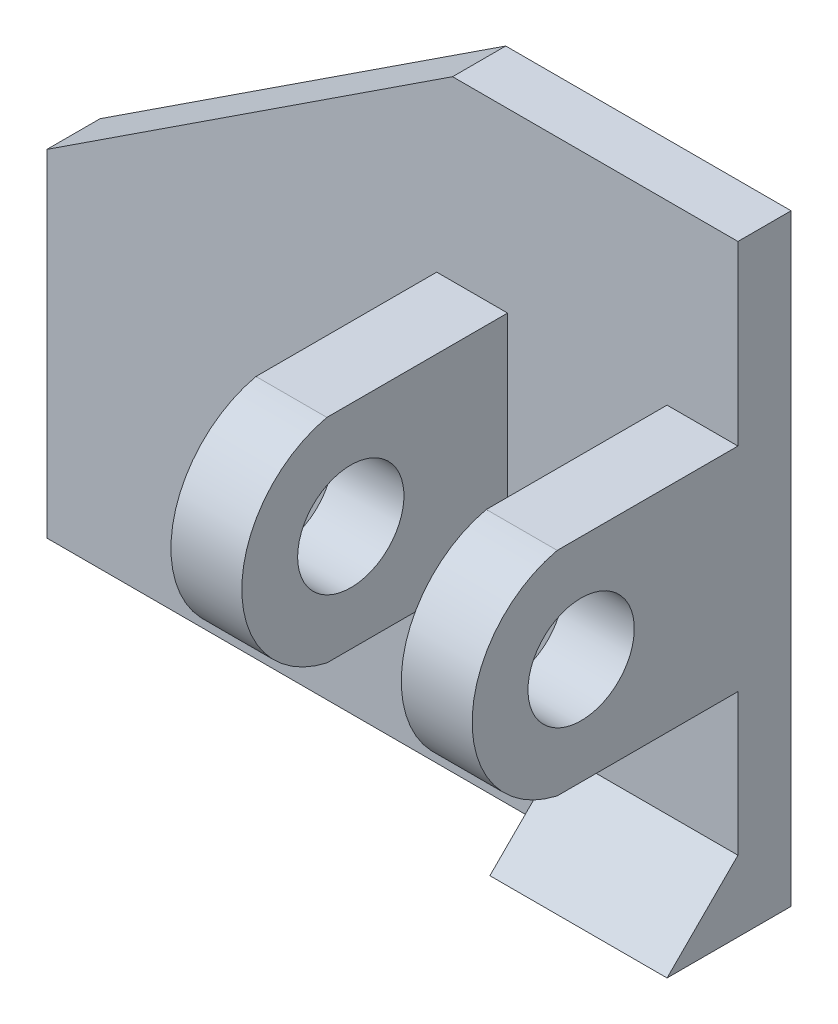
ISO-10303-21;
HEADER;
FILE_DESCRIPTION(('STEP AP214'),'2;1');
FILE_NAME('part.step','',(''),(''),'','','');
FILE_SCHEMA(('AUTOMOTIVE_DESIGN { 1 0 10303 214 1 1 1 1 }'));
ENDSEC;
DATA;
#1=APPLICATION_CONTEXT('core data for automotive mechanical design processes');
#2=APPLICATION_PROTOCOL_DEFINITION('international standard','automotive_design',2000,#1);
#3=PRODUCT_CONTEXT('',#1,'mechanical');
#4=PRODUCT('Part','Part','',(#3));
#5=PRODUCT_RELATED_PRODUCT_CATEGORY('part','',(#4));
#6=PRODUCT_DEFINITION_FORMATION('','',#4);
#7=PRODUCT_DEFINITION_CONTEXT('part definition',#1,'design');
#8=PRODUCT_DEFINITION('design','',#6,#7);
#9=PRODUCT_DEFINITION_SHAPE('','',#8);
#10=(LENGTH_UNIT() NAMED_UNIT(*) SI_UNIT(.MILLI.,.METRE.));
#11=(NAMED_UNIT(*) PLANE_ANGLE_UNIT() SI_UNIT($,.RADIAN.));
#12=(NAMED_UNIT(*) SI_UNIT($,.STERADIAN.) SOLID_ANGLE_UNIT());
#13=UNCERTAINTY_MEASURE_WITH_UNIT(LENGTH_MEASURE(1.E-05),#10,'distance_accuracy_value','');
#14=(GEOMETRIC_REPRESENTATION_CONTEXT(3) GLOBAL_UNCERTAINTY_ASSIGNED_CONTEXT((#13)) GLOBAL_UNIT_ASSIGNED_CONTEXT((#10,
#11,#12)) REPRESENTATION_CONTEXT('',''));
#15=CARTESIAN_POINT('',(0.,0.,0.));
#16=DIRECTION('',(0.,0.,1.));
#17=DIRECTION('',(1.,0.,0.));
#18=AXIS2_PLACEMENT_3D('',#15,#16,#17);
#19=CARTESIAN_POINT('',(14.5,0.,3.));
#20=DIRECTION('',(1.,0.,0.));
#21=DIRECTION('',(0.,1.,0.));
#22=AXIS2_PLACEMENT_3D('',#19,#20,#21);
#23=PLANE('',#22);
#24=DIRECTION('',(0.,-1.,0.));
#25=VECTOR('',#24,1.);
#26=CARTESIAN_POINT('',(14.5,0.,3.));
#27=LINE('',#26,#25);
#28=CARTESIAN_POINT('',(14.5,-6.99999999999999,3.));
#29=VERTEX_POINT('',#28);
#30=CARTESIAN_POINT('',(14.5,-15.,3.));
#31=VERTEX_POINT('',#30);
#32=EDGE_CURVE('E303',#29,#31,#27,.T.);
#33=ORIENTED_EDGE('',*,*,#32,.T.);
#34=DIRECTION('',(0.,-0.707106781186551,0.707106781186544));
#35=VECTOR('',#34,1.);
#36=CARTESIAN_POINT('',(14.5,-7.49999999999994,-4.50000000000002));
#37=LINE('',#36,#35);
#38=CARTESIAN_POINT('',(14.5,-19.,6.99999999999993));
#39=VERTEX_POINT('',#38);
#40=EDGE_CURVE('E12',#31,#39,#37,.T.);
#41=ORIENTED_EDGE('',*,*,#40,.T.);
#42=DIRECTION('',(0.,0.,-1.));
#43=VECTOR('',#42,1.);
#44=CARTESIAN_POINT('',(14.5,-19.,3.));
#45=LINE('',#44,#43);
#46=CARTESIAN_POINT('',(14.5,-19.,0.));
#47=VERTEX_POINT('',#46);
#48=EDGE_CURVE('E348',#39,#47,#45,.T.);
#49=ORIENTED_EDGE('',*,*,#48,.T.);
#50=DIRECTION('',(0.,-1.,0.));
#51=VECTOR('',#50,1.);
#52=CARTESIAN_POINT('',(14.5,0.,0.));
#53=LINE('',#52,#51);
#54=CARTESIAN_POINT('',(14.5,15.,0.));
#55=VERTEX_POINT('',#54);
#56=EDGE_CURVE('E342',#55,#47,#53,.T.);
#57=ORIENTED_EDGE('',*,*,#56,.F.);
#58=DIRECTION('',(0.,0.,-1.));
#59=VECTOR('',#58,1.);
#60=CARTESIAN_POINT('',(14.5,15.,3.));
#61=LINE('',#60,#59);
#62=CARTESIAN_POINT('',(14.5,15.,3.));
#63=VERTEX_POINT('',#62);
#64=EDGE_CURVE('E330',#63,#55,#61,.T.);
#65=ORIENTED_EDGE('',*,*,#64,.F.);
#66=CARTESIAN_POINT('',(14.5,5.00000000000001,3.));
#67=VERTEX_POINT('',#66);
#68=EDGE_CURVE('E306',#63,#67,#27,.T.);
#69=ORIENTED_EDGE('',*,*,#68,.T.);
#70=DIRECTION('',(0.,0.,-1.));
#71=VECTOR('',#70,1.);
#72=CARTESIAN_POINT('',(14.5,5.00000000000001,18.));
#73=LINE('',#72,#71);
#74=CARTESIAN_POINT('',(14.5,5.00000000000001,13.2));
#75=VERTEX_POINT('',#74);
#76=EDGE_CURVE('E284',#75,#67,#73,.T.);
#77=ORIENTED_EDGE('',*,*,#76,.F.);
#78=CARTESIAN_POINT('',(14.5,-0.999999999999992,11.85));
#79=DIRECTION('',(1.,0.,0.));
#80=DIRECTION('',(0.,1.,0.));
#81=AXIS2_PLACEMENT_3D('',#78,#79,#80);
#82=CIRCLE('',#81,6.15);
#83=CARTESIAN_POINT('',(14.5,-6.99999999999999,13.2));
#84=VERTEX_POINT('',#83);
#85=EDGE_CURVE('E275',#75,#84,#82,.T.);
#86=ORIENTED_EDGE('',*,*,#85,.T.);
#87=DIRECTION('',(0.,0.,-1.));
#88=VECTOR('',#87,1.);
#89=CARTESIAN_POINT('',(14.5,-6.99999999999999,18.));
#90=LINE('',#89,#88);
#91=EDGE_CURVE('E286',#84,#29,#90,.T.);
#92=ORIENTED_EDGE('',*,*,#91,.T.);
#93=EDGE_LOOP('',(#33,#41,#49,#57,#65,#69,#77,#86,#92));
#94=FACE_BOUND('',#93,.T.);
#95=CARTESIAN_POINT('',(14.5,-0.999999999999992,11.85));
#96=DIRECTION('',(1.,0.,0.));
#97=DIRECTION('',(0.,1.,0.));
#98=AXIS2_PLACEMENT_3D('',#95,#96,#97);
#99=CIRCLE('',#98,3.);
#100=CARTESIAN_POINT('',(14.5,2.00000000000001,11.85));
#101=VERTEX_POINT('',#100);
#102=EDGE_CURVE('E258',#101,#101,#99,.T.);
#103=ORIENTED_EDGE('',*,*,#102,.F.);
#104=EDGE_LOOP('',(#103));
#105=FACE_BOUND('',#104,.T.);
#106=ADVANCED_FACE('F119',(#94,#105),#23,.T.);
#107=CARTESIAN_POINT('',(10.5,0.,18.));
#108=DIRECTION('',(1.,0.,0.));
#109=DIRECTION('',(0.,1.,0.));
#110=AXIS2_PLACEMENT_3D('',#107,#108,#109);
#111=PLANE('',#110);
#112=CARTESIAN_POINT('',(10.5,-0.999999999999992,11.85));
#113=DIRECTION('',(1.,0.,0.));
#114=DIRECTION('',(0.,1.,0.));
#115=AXIS2_PLACEMENT_3D('',#112,#113,#114);
#116=CIRCLE('',#115,3.);
#117=CARTESIAN_POINT('',(10.5,2.00000000000001,11.85));
#118=VERTEX_POINT('',#117);
#119=EDGE_CURVE('E255',#118,#118,#116,.T.);
#120=ORIENTED_EDGE('',*,*,#119,.T.);
#121=EDGE_LOOP('',(#120));
#122=FACE_BOUND('',#121,.T.);
#123=DIRECTION('',(0.,0.,-1.));
#124=VECTOR('',#123,1.);
#125=CARTESIAN_POINT('',(10.5,-7.,18.));
#126=LINE('',#125,#124);
#127=CARTESIAN_POINT('',(10.5,-6.99999999999999,13.2));
#128=VERTEX_POINT('',#127);
#129=CARTESIAN_POINT('',(10.5,-7.,3.));
#130=VERTEX_POINT('',#129);
#131=EDGE_CURVE('E288',#128,#130,#126,.T.);
#132=ORIENTED_EDGE('',*,*,#131,.F.);
#133=CARTESIAN_POINT('',(10.5,-0.999999999999992,11.85));
#134=DIRECTION('',(1.,0.,0.));
#135=DIRECTION('',(0.,1.,0.));
#136=AXIS2_PLACEMENT_3D('',#133,#134,#135);
#137=CIRCLE('',#136,6.15);
#138=CARTESIAN_POINT('',(10.5,5.00000000000001,13.2));
#139=VERTEX_POINT('',#138);
#140=EDGE_CURVE('E273',#139,#128,#137,.T.);
#141=ORIENTED_EDGE('',*,*,#140,.F.);
#142=DIRECTION('',(0.,0.,-1.));
#143=VECTOR('',#142,1.);
#144=CARTESIAN_POINT('',(10.5,5.00000000000001,18.));
#145=LINE('',#144,#143);
#146=CARTESIAN_POINT('',(10.5,5.00000000000001,3.));
#147=VERTEX_POINT('',#146);
#148=EDGE_CURVE('E290',#139,#147,#145,.T.);
#149=ORIENTED_EDGE('',*,*,#148,.T.);
#150=DIRECTION('',(0.,-1.,0.));
#151=VECTOR('',#150,1.);
#152=CARTESIAN_POINT('',(10.5,0.,3.));
#153=LINE('',#152,#151);
#154=EDGE_CURVE('E309',#147,#130,#153,.T.);
#155=ORIENTED_EDGE('',*,*,#154,.T.);
#156=EDGE_LOOP('',(#132,#141,#149,#155));
#157=FACE_BOUND('',#156,.T.);
#158=ADVANCED_FACE('F374',(#122,#157),#111,.F.);
#159=CARTESIAN_POINT('',(1.5,0.,18.));
#160=DIRECTION('',(-1.,0.,0.));
#161=DIRECTION('',(0.,0.,1.));
#162=AXIS2_PLACEMENT_3D('',#159,#160,#161);
#163=PLANE('',#162);
#164=CARTESIAN_POINT('',(1.49999999999999,-0.999999999999991,11.85));
#165=DIRECTION('',(-1.,0.,0.));
#166=DIRECTION('',(0.,0.,1.));
#167=AXIS2_PLACEMENT_3D('',#164,#165,#166);
#168=CIRCLE('',#167,3.);
#169=CARTESIAN_POINT('',(1.49999999999999,-0.999999999999991,14.85));
#170=VERTEX_POINT('',#169);
#171=EDGE_CURVE('E252',#170,#170,#168,.T.);
#172=ORIENTED_EDGE('',*,*,#171,.T.);
#173=EDGE_LOOP('',(#172));
#174=FACE_BOUND('',#173,.T.);
#175=CARTESIAN_POINT('',(1.49999999999999,-0.999999999999991,11.85));
#176=DIRECTION('',(-1.,0.,0.));
#177=DIRECTION('',(0.,0.,1.));
#178=AXIS2_PLACEMENT_3D('',#175,#176,#177);
#179=CIRCLE('',#178,6.15);
#180=CARTESIAN_POINT('',(1.49999999999999,-6.99999999999999,13.2));
#181=VERTEX_POINT('',#180);
#182=CARTESIAN_POINT('',(1.49999999999999,5.00000000000001,13.2));
#183=VERTEX_POINT('',#182);
#184=EDGE_CURVE('E271',#181,#183,#179,.T.);
#185=ORIENTED_EDGE('',*,*,#184,.F.);
#186=DIRECTION('',(0.,0.,-1.));
#187=VECTOR('',#186,1.);
#188=CARTESIAN_POINT('',(1.5,-6.99999999999999,18.));
#189=LINE('',#188,#187);
#190=CARTESIAN_POINT('',(1.5,-6.99999999999999,3.));
#191=VERTEX_POINT('',#190);
#192=EDGE_CURVE('E282',#181,#191,#189,.T.);
#193=ORIENTED_EDGE('',*,*,#192,.T.);
#194=DIRECTION('',(0.,1.,0.));
#195=VECTOR('',#194,1.);
#196=CARTESIAN_POINT('',(1.5,0.,3.));
#197=LINE('',#196,#195);
#198=CARTESIAN_POINT('',(1.5,5.00000000000001,3.));
#199=VERTEX_POINT('',#198);
#200=EDGE_CURVE('E321',#191,#199,#197,.T.);
#201=ORIENTED_EDGE('',*,*,#200,.T.);
#202=DIRECTION('',(0.,0.,-1.));
#203=VECTOR('',#202,1.);
#204=CARTESIAN_POINT('',(1.5,5.00000000000001,18.));
#205=LINE('',#204,#203);
#206=EDGE_CURVE('E280',#183,#199,#205,.T.);
#207=ORIENTED_EDGE('',*,*,#206,.F.);
#208=EDGE_LOOP('',(#185,#193,#201,#207));
#209=FACE_BOUND('',#208,.T.);
#210=ADVANCED_FACE('F409',(#174,#209),#163,.F.);
#211=CARTESIAN_POINT('',(-2.5,0.,18.));
#212=DIRECTION('',(-1.,0.,0.));
#213=DIRECTION('',(0.,-1.,0.));
#214=AXIS2_PLACEMENT_3D('',#211,#212,#213);
#215=PLANE('',#214);
#216=CARTESIAN_POINT('',(-2.5,-0.999999999999991,11.85));
#217=DIRECTION('',(-1.,0.,0.));
#218=DIRECTION('',(0.,-1.,0.));
#219=AXIS2_PLACEMENT_3D('',#216,#217,#218);
#220=CIRCLE('',#219,3.);
#221=CARTESIAN_POINT('',(-2.5,-3.99999999999999,11.85));
#222=VERTEX_POINT('',#221);
#223=EDGE_CURVE('E251',#222,#222,#220,.T.);
#224=ORIENTED_EDGE('',*,*,#223,.F.);
#225=EDGE_LOOP('',(#224));
#226=FACE_BOUND('',#225,.T.);
#227=DIRECTION('',(0.,0.,-1.));
#228=VECTOR('',#227,1.);
#229=CARTESIAN_POINT('',(-2.5,-6.99999999999999,18.));
#230=LINE('',#229,#228);
#231=CARTESIAN_POINT('',(-2.5,-6.99999999999999,13.2));
#232=VERTEX_POINT('',#231);
#233=CARTESIAN_POINT('',(-2.5,-6.99999999999999,3.));
#234=VERTEX_POINT('',#233);
#235=EDGE_CURVE('E276',#232,#234,#230,.T.);
#236=ORIENTED_EDGE('',*,*,#235,.F.);
#237=CARTESIAN_POINT('',(-2.5,-0.999999999999991,11.85));
#238=DIRECTION('',(-1.,0.,0.));
#239=DIRECTION('',(0.,-1.,0.));
#240=AXIS2_PLACEMENT_3D('',#237,#238,#239);
#241=CIRCLE('',#240,6.15);
#242=CARTESIAN_POINT('',(-2.5,5.00000000000001,13.2));
#243=VERTEX_POINT('',#242);
#244=EDGE_CURVE('E268',#232,#243,#241,.T.);
#245=ORIENTED_EDGE('',*,*,#244,.T.);
#246=DIRECTION('',(0.,0.,-1.));
#247=VECTOR('',#246,1.);
#248=CARTESIAN_POINT('',(-2.5,5.00000000000001,18.));
#249=LINE('',#248,#247);
#250=CARTESIAN_POINT('',(-2.5,5.00000000000001,3.));
#251=VERTEX_POINT('',#250);
#252=EDGE_CURVE('E278',#243,#251,#249,.T.);
#253=ORIENTED_EDGE('',*,*,#252,.T.);
#254=DIRECTION('',(0.,1.,0.));
#255=VECTOR('',#254,1.);
#256=CARTESIAN_POINT('',(-2.5,0.,3.));
#257=LINE('',#256,#255);
#258=EDGE_CURVE('E327',#234,#251,#257,.T.);
#259=ORIENTED_EDGE('',*,*,#258,.F.);
#260=EDGE_LOOP('',(#236,#245,#253,#259));
#261=FACE_BOUND('',#260,.T.);
#262=ADVANCED_FACE('F426',(#226,#261),#215,.T.);
#263=CARTESIAN_POINT('',(0.,-7.,18.));
#264=DIRECTION('',(0.,-1.,0.));
#265=DIRECTION('',(1.,0.,0.));
#266=AXIS2_PLACEMENT_3D('',#263,#264,#265);
#267=PLANE('',#266);
#268=ORIENTED_EDGE('',*,*,#91,.F.);
#269=DIRECTION('',(1.,0.,0.));
#270=VECTOR('',#269,1.);
#271=CARTESIAN_POINT('',(-24.5,-6.99999999999999,13.2));
#272=LINE('',#271,#270);
#273=EDGE_CURVE('E240',#128,#84,#272,.T.);
#274=ORIENTED_EDGE('',*,*,#273,.F.);
#275=ORIENTED_EDGE('',*,*,#131,.T.);
#276=DIRECTION('',(-1.,0.,0.));
#277=VECTOR('',#276,1.);
#278=CARTESIAN_POINT('',(0.,-7.,3.));
#279=LINE('',#278,#277);
#280=EDGE_CURVE('E305',#29,#130,#279,.T.);
#281=ORIENTED_EDGE('',*,*,#280,.F.);
#282=EDGE_LOOP('',(#268,#274,#275,#281));
#283=FACE_BOUND('',#282,.T.);
#284=ADVANCED_FACE('F370',(#283),#267,.T.);
#285=CARTESIAN_POINT('',(0.,-6.99999999999999,18.));
#286=DIRECTION('',(0.,1.,0.));
#287=DIRECTION('',(0.,0.,1.));
#288=AXIS2_PLACEMENT_3D('',#285,#286,#287);
#289=PLANE('',#288);
#290=EDGE_CURVE('E248',#232,#181,#272,.T.);
#291=ORIENTED_EDGE('',*,*,#290,.F.);
#292=ORIENTED_EDGE('',*,*,#235,.T.);
#293=DIRECTION('',(1.,0.,0.));
#294=VECTOR('',#293,1.);
#295=CARTESIAN_POINT('',(0.,-6.99999999999999,3.));
#296=LINE('',#295,#294);
#297=EDGE_CURVE('E324',#234,#191,#296,.T.);
#298=ORIENTED_EDGE('',*,*,#297,.T.);
#299=ORIENTED_EDGE('',*,*,#192,.F.);
#300=EDGE_LOOP('',(#291,#292,#298,#299));
#301=FACE_BOUND('',#300,.T.);
#302=ADVANCED_FACE('F422',(#301),#289,.F.);
#303=CARTESIAN_POINT('',(0.,5.,18.));
#304=DIRECTION('',(0.,-1.,0.));
#305=DIRECTION('',(1.,0.,0.));
#306=AXIS2_PLACEMENT_3D('',#303,#304,#305);
#307=PLANE('',#306);
#308=DIRECTION('',(1.,0.,0.));
#309=VECTOR('',#308,1.);
#310=CARTESIAN_POINT('',(-24.5,5.00000000000001,13.2));
#311=LINE('',#310,#309);
#312=EDGE_CURVE('E261',#139,#75,#311,.T.);
#313=ORIENTED_EDGE('',*,*,#312,.T.);
#314=ORIENTED_EDGE('',*,*,#76,.T.);
#315=DIRECTION('',(-1.,0.,0.));
#316=VECTOR('',#315,1.);
#317=CARTESIAN_POINT('',(0.,5.,3.));
#318=LINE('',#317,#316);
#319=EDGE_CURVE('E312',#67,#147,#318,.T.);
#320=ORIENTED_EDGE('',*,*,#319,.T.);
#321=ORIENTED_EDGE('',*,*,#148,.F.);
#322=EDGE_LOOP('',(#313,#314,#320,#321));
#323=FACE_BOUND('',#322,.T.);
#324=ADVANCED_FACE('F377',(#323),#307,.F.);
#325=CARTESIAN_POINT('',(0.,5.00000000000001,18.));
#326=DIRECTION('',(0.,-1.,0.));
#327=DIRECTION('',(1.,0.,0.));
#328=AXIS2_PLACEMENT_3D('',#325,#326,#327);
#329=PLANE('',#328);
#330=EDGE_CURVE('E265',#243,#183,#311,.T.);
#331=ORIENTED_EDGE('',*,*,#330,.T.);
#332=ORIENTED_EDGE('',*,*,#206,.T.);
#333=DIRECTION('',(-1.,0.,0.));
#334=VECTOR('',#333,1.);
#335=CARTESIAN_POINT('',(0.,5.00000000000001,3.));
#336=LINE('',#335,#334);
#337=EDGE_CURVE('E318',#199,#251,#336,.T.);
#338=ORIENTED_EDGE('',*,*,#337,.T.);
#339=ORIENTED_EDGE('',*,*,#252,.F.);
#340=EDGE_LOOP('',(#331,#332,#338,#339));
#341=FACE_BOUND('',#340,.T.);
#342=ADVANCED_FACE('F421',(#341),#329,.F.);
#343=CARTESIAN_POINT('',(0.,15.,3.));
#344=DIRECTION('',(0.,1.,0.));
#345=DIRECTION('',(0.,0.,1.));
#346=AXIS2_PLACEMENT_3D('',#343,#344,#345);
#347=PLANE('',#346);
#348=DIRECTION('',(1.,0.,0.));
#349=VECTOR('',#348,1.);
#350=CARTESIAN_POINT('',(0.,15.,0.));
#351=LINE('',#350,#349);
#352=CARTESIAN_POINT('',(-1.60526315789473,15.,0.));
#353=VERTEX_POINT('',#352);
#354=EDGE_CURVE('E292',#353,#55,#351,.T.);
#355=ORIENTED_EDGE('',*,*,#354,.F.);
#356=DIRECTION('',(0.,0.,-1.));
#357=VECTOR('',#356,1.);
#358=CARTESIAN_POINT('',(-1.60526315789473,15.,3.));
#359=LINE('',#358,#357);
#360=CARTESIAN_POINT('',(-1.60526315789473,15.,3.));
#361=VERTEX_POINT('',#360);
#362=EDGE_CURVE('E354',#361,#353,#359,.T.);
#363=ORIENTED_EDGE('',*,*,#362,.F.);
#364=DIRECTION('',(1.,0.,0.));
#365=VECTOR('',#364,1.);
#366=CARTESIAN_POINT('',(0.,15.,3.));
#367=LINE('',#366,#365);
#368=EDGE_CURVE('E293',#361,#63,#367,.T.);
#369=ORIENTED_EDGE('',*,*,#368,.T.);
#370=ORIENTED_EDGE('',*,*,#64,.T.);
#371=EDGE_LOOP('',(#355,#363,#369,#370));
#372=FACE_BOUND('',#371,.T.);
#373=ADVANCED_FACE('F383',(#372),#347,.T.);
#374=CARTESIAN_POINT('',(-7.358153078203,11.2308652246256,3.));
#375=DIRECTION('',(0.548026257310873,-0.836461129579753,0.));
#376=DIRECTION('',(0.836461129579753,0.548026257310873,0.));
#377=AXIS2_PLACEMENT_3D('',#374,#375,#376);
#378=PLANE('',#377);
#379=DIRECTION('',(-0.836461129579753,-0.548026257310873,0.));
#380=VECTOR('',#379,1.);
#381=CARTESIAN_POINT('',(-7.358153078203,11.2308652246256,0.));
#382=LINE('',#381,#380);
#383=CARTESIAN_POINT('',(-24.5,0.,0.));
#384=VERTEX_POINT('',#383);
#385=EDGE_CURVE('E333',#353,#384,#382,.T.);
#386=ORIENTED_EDGE('',*,*,#385,.T.);
#387=DIRECTION('',(0.,0.,-1.));
#388=VECTOR('',#387,1.);
#389=CARTESIAN_POINT('',(-24.5,0.,3.));
#390=LINE('',#389,#388);
#391=CARTESIAN_POINT('',(-24.5,0.,3.));
#392=VERTEX_POINT('',#391);
#393=EDGE_CURVE('E352',#392,#384,#390,.T.);
#394=ORIENTED_EDGE('',*,*,#393,.F.);
#395=DIRECTION('',(-0.836461129579753,-0.548026257310873,0.));
#396=VECTOR('',#395,1.);
#397=CARTESIAN_POINT('',(-7.358153078203,11.2308652246256,3.));
#398=LINE('',#397,#396);
#399=EDGE_CURVE('E296',#361,#392,#398,.T.);
#400=ORIENTED_EDGE('',*,*,#399,.F.);
#401=ORIENTED_EDGE('',*,*,#362,.T.);
#402=EDGE_LOOP('',(#386,#394,#400,#401));
#403=FACE_BOUND('',#402,.T.);
#404=ADVANCED_FACE('F387',(#403),#378,.F.);
#405=CARTESIAN_POINT('',(-24.5,0.,3.));
#406=DIRECTION('',(-1.,0.,0.));
#407=DIRECTION('',(0.,0.,1.));
#408=AXIS2_PLACEMENT_3D('',#405,#406,#407);
#409=PLANE('',#408);
#410=DIRECTION('',(0.,1.,0.));
#411=VECTOR('',#410,1.);
#412=CARTESIAN_POINT('',(-24.5,0.,0.));
#413=LINE('',#412,#411);
#414=CARTESIAN_POINT('',(-24.5,-19.,0.));
#415=VERTEX_POINT('',#414);
#416=EDGE_CURVE('E336',#415,#384,#413,.T.);
#417=ORIENTED_EDGE('',*,*,#416,.F.);
#418=DIRECTION('',(0.,0.,-1.));
#419=VECTOR('',#418,1.);
#420=CARTESIAN_POINT('',(-24.5,-19.,3.));
#421=LINE('',#420,#419);
#422=CARTESIAN_POINT('',(-24.5,-19.,3.));
#423=VERTEX_POINT('',#422);
#424=EDGE_CURVE('E350',#423,#415,#421,.T.);
#425=ORIENTED_EDGE('',*,*,#424,.F.);
#426=DIRECTION('',(0.,1.,0.));
#427=VECTOR('',#426,1.);
#428=CARTESIAN_POINT('',(-24.5,0.,3.));
#429=LINE('',#428,#427);
#430=EDGE_CURVE('E299',#423,#392,#429,.T.);
#431=ORIENTED_EDGE('',*,*,#430,.T.);
#432=ORIENTED_EDGE('',*,*,#393,.T.);
#433=EDGE_LOOP('',(#417,#425,#431,#432));
#434=FACE_BOUND('',#433,.T.);
#435=ADVANCED_FACE('F391',(#434),#409,.T.);
#436=CARTESIAN_POINT('',(0.,-19.,3.));
#437=DIRECTION('',(0.,1.,0.));
#438=DIRECTION('',(-1.,0.,0.));
#439=AXIS2_PLACEMENT_3D('',#436,#437,#438);
#440=PLANE('',#439);
#441=ORIENTED_EDGE('',*,*,#48,.F.);
#442=DIRECTION('',(-1.,0.,0.));
#443=VECTOR('',#442,1.);
#444=CARTESIAN_POINT('',(0.,-19.,6.99999999999993));
#445=LINE('',#444,#443);
#446=CARTESIAN_POINT('',(4.5,-19.,6.99999999999993));
#447=VERTEX_POINT('',#446);
#448=EDGE_CURVE('E134',#39,#447,#445,.T.);
#449=ORIENTED_EDGE('',*,*,#448,.T.);
#450=DIRECTION('',(0.,0.,-1.));
#451=VECTOR('',#450,1.);
#452=CARTESIAN_POINT('',(4.5,-19.,8.));
#453=LINE('',#452,#451);
#454=CARTESIAN_POINT('',(4.5,-19.,3.));
#455=VERTEX_POINT('',#454);
#456=EDGE_CURVE('E228',#447,#455,#453,.T.);
#457=ORIENTED_EDGE('',*,*,#456,.T.);
#458=DIRECTION('',(1.,0.,0.));
#459=VECTOR('',#458,1.);
#460=CARTESIAN_POINT('',(0.,-19.,3.));
#461=LINE('',#460,#459);
#462=EDGE_CURVE('E239',#423,#455,#461,.T.);
#463=ORIENTED_EDGE('',*,*,#462,.F.);
#464=ORIENTED_EDGE('',*,*,#424,.T.);
#465=DIRECTION('',(1.,0.,0.));
#466=VECTOR('',#465,1.);
#467=CARTESIAN_POINT('',(0.,-19.,0.));
#468=LINE('',#467,#466);
#469=EDGE_CURVE('E339',#415,#47,#468,.T.);
#470=ORIENTED_EDGE('',*,*,#469,.T.);
#471=EDGE_LOOP('',(#441,#449,#457,#463,#464,#470));
#472=FACE_BOUND('',#471,.T.);
#473=ADVANCED_FACE('F393',(#472),#440,.F.);
#474=CARTESIAN_POINT('',(-15.5,-15.,3.));
#475=DIRECTION('',(0.,0.,-1.));
#476=DIRECTION('',(-1.,0.,0.));
#477=AXIS2_PLACEMENT_3D('',#474,#475,#476);
#478=CYLINDRICAL_SURFACE('',#477,1.5);
#479=CARTESIAN_POINT('',(-15.5,-15.,3.));
#480=DIRECTION('',(0.,0.,1.));
#481=DIRECTION('',(1.,0.,0.));
#482=AXIS2_PLACEMENT_3D('',#479,#480,#481);
#483=CIRCLE('',#482,1.5);
#484=CARTESIAN_POINT('',(-14.,-15.,3.));
#485=VERTEX_POINT('',#484);
#486=EDGE_CURVE('E315',#485,#485,#483,.T.);
#487=ORIENTED_EDGE('',*,*,#486,.T.);
#488=EDGE_LOOP('',(#487));
#489=FACE_BOUND('',#488,.T.);
#490=CARTESIAN_POINT('',(-15.5,-15.,0.));
#491=DIRECTION('',(0.,0.,1.));
#492=DIRECTION('',(1.,0.,0.));
#493=AXIS2_PLACEMENT_3D('',#490,#491,#492);
#494=CIRCLE('',#493,1.5);
#495=CARTESIAN_POINT('',(-14.,-15.,0.));
#496=VERTEX_POINT('',#495);
#497=EDGE_CURVE('E297',#496,#496,#494,.T.);
#498=ORIENTED_EDGE('',*,*,#497,.F.);
#499=EDGE_LOOP('',(#498));
#500=FACE_BOUND('',#499,.T.);
#501=ADVANCED_FACE('F395',(#489,#500),#478,.F.);
#502=CARTESIAN_POINT('',(0.,0.,3.));
#503=DIRECTION('',(0.,0.,1.));
#504=DIRECTION('',(1.,0.,0.));
#505=AXIS2_PLACEMENT_3D('',#502,#503,#504);
#506=PLANE('',#505);
#507=DIRECTION('',(0.,-1.,0.));
#508=VECTOR('',#507,1.);
#509=CARTESIAN_POINT('',(4.5,0.,3.));
#510=LINE('',#509,#508);
#511=CARTESIAN_POINT('',(4.5,-15.,3.));
#512=VERTEX_POINT('',#511);
#513=EDGE_CURVE('E226',#512,#455,#510,.T.);
#514=ORIENTED_EDGE('',*,*,#513,.F.);
#515=DIRECTION('',(1.,0.,0.));
#516=VECTOR('',#515,1.);
#517=CARTESIAN_POINT('',(0.,-15.,3.));
#518=LINE('',#517,#516);
#519=EDGE_CURVE('E236',#512,#31,#518,.T.);
#520=ORIENTED_EDGE('',*,*,#519,.T.);
#521=ORIENTED_EDGE('',*,*,#32,.F.);
#522=ORIENTED_EDGE('',*,*,#280,.T.);
#523=ORIENTED_EDGE('',*,*,#154,.F.);
#524=ORIENTED_EDGE('',*,*,#319,.F.);
#525=ORIENTED_EDGE('',*,*,#68,.F.);
#526=ORIENTED_EDGE('',*,*,#368,.F.);
#527=ORIENTED_EDGE('',*,*,#399,.T.);
#528=ORIENTED_EDGE('',*,*,#430,.F.);
#529=ORIENTED_EDGE('',*,*,#462,.T.);
#530=EDGE_LOOP('',(#514,#520,#521,#522,#523,#524,#525,#526,#527,#528,#529));
#531=FACE_BOUND('',#530,.T.);
#532=ORIENTED_EDGE('',*,*,#486,.F.);
#533=EDGE_LOOP('',(#532));
#534=FACE_BOUND('',#533,.T.);
#535=ORIENTED_EDGE('',*,*,#337,.F.);
#536=ORIENTED_EDGE('',*,*,#200,.F.);
#537=ORIENTED_EDGE('',*,*,#297,.F.);
#538=ORIENTED_EDGE('',*,*,#258,.T.);
#539=EDGE_LOOP('',(#535,#536,#537,#538));
#540=FACE_BOUND('',#539,.T.);
#541=ADVANCED_FACE('F233',(#531,#534,#540),#506,.T.);
#542=CARTESIAN_POINT('',(0.,0.,0.));
#543=DIRECTION('',(0.,0.,1.));
#544=DIRECTION('',(1.,0.,0.));
#545=AXIS2_PLACEMENT_3D('',#542,#543,#544);
#546=PLANE('',#545);
#547=ORIENTED_EDGE('',*,*,#56,.T.);
#548=ORIENTED_EDGE('',*,*,#469,.F.);
#549=ORIENTED_EDGE('',*,*,#416,.T.);
#550=ORIENTED_EDGE('',*,*,#385,.F.);
#551=ORIENTED_EDGE('',*,*,#354,.T.);
#552=EDGE_LOOP('',(#547,#548,#549,#550,#551));
#553=FACE_BOUND('',#552,.T.);
#554=ORIENTED_EDGE('',*,*,#497,.T.);
#555=EDGE_LOOP('',(#554));
#556=FACE_BOUND('',#555,.T.);
#557=ADVANCED_FACE('F413',(#553,#556),#546,.F.);
#558=CARTESIAN_POINT('',(-24.5,-0.99999999999999,11.85));
#559=DIRECTION('',(1.,0.,0.));
#560=DIRECTION('',(0.,1.,0.));
#561=AXIS2_PLACEMENT_3D('',#558,#559,#560);
#562=CYLINDRICAL_SURFACE('',#561,6.15);
#563=ORIENTED_EDGE('',*,*,#184,.T.);
#564=ORIENTED_EDGE('',*,*,#330,.F.);
#565=ORIENTED_EDGE('',*,*,#244,.F.);
#566=ORIENTED_EDGE('',*,*,#290,.T.);
#567=EDGE_LOOP('',(#563,#564,#565,#566));
#568=FACE_BOUND('',#567,.T.);
#569=ADVANCED_FACE('F416',(#568),#562,.T.);
#570=ORIENTED_EDGE('',*,*,#312,.F.);
#571=ORIENTED_EDGE('',*,*,#140,.T.);
#572=ORIENTED_EDGE('',*,*,#273,.T.);
#573=ORIENTED_EDGE('',*,*,#85,.F.);
#574=EDGE_LOOP('',(#570,#571,#572,#573));
#575=FACE_BOUND('',#574,.T.);
#576=ADVANCED_FACE('F365',(#575),#562,.T.);
#577=CARTESIAN_POINT('',(-24.5,-0.99999999999999,11.85));
#578=DIRECTION('',(1.,0.,0.));
#579=DIRECTION('',(0.,1.,0.));
#580=AXIS2_PLACEMENT_3D('',#577,#578,#579);
#581=CYLINDRICAL_SURFACE('',#580,3.);
#582=ORIENTED_EDGE('',*,*,#223,.T.);
#583=EDGE_LOOP('',(#582));
#584=FACE_BOUND('',#583,.T.);
#585=ORIENTED_EDGE('',*,*,#171,.F.);
#586=EDGE_LOOP('',(#585));
#587=FACE_BOUND('',#586,.T.);
#588=ADVANCED_FACE('F441',(#584,#587),#581,.F.);
#589=ORIENTED_EDGE('',*,*,#102,.T.);
#590=EDGE_LOOP('',(#589));
#591=FACE_BOUND('',#590,.T.);
#592=ORIENTED_EDGE('',*,*,#119,.F.);
#593=EDGE_LOOP('',(#592));
#594=FACE_BOUND('',#593,.T.);
#595=ADVANCED_FACE('F442',(#591,#594),#581,.F.);
#596=CARTESIAN_POINT('',(4.5,0.,8.));
#597=DIRECTION('',(-1.,0.,0.));
#598=DIRECTION('',(0.,0.,1.));
#599=AXIS2_PLACEMENT_3D('',#596,#597,#598);
#600=PLANE('',#599);
#601=ORIENTED_EDGE('',*,*,#456,.F.);
#602=DIRECTION('',(0.,0.707106781186551,-0.707106781186544));
#603=VECTOR('',#602,1.);
#604=CARTESIAN_POINT('',(4.5,-9.99999999999994,-2.00000000000004));
#605=LINE('',#604,#603);
#606=EDGE_CURVE('E127',#447,#512,#605,.T.);
#607=ORIENTED_EDGE('',*,*,#606,.T.);
#608=ORIENTED_EDGE('',*,*,#513,.T.);
#609=EDGE_LOOP('',(#601,#607,#608));
#610=FACE_BOUND('',#609,.T.);
#611=ADVANCED_FACE('F225',(#610),#600,.T.);
#612=CARTESIAN_POINT('',(0.,-20.0000000000001,8.));
#613=DIRECTION('',(0.,0.707106781186544,0.707106781186551));
#614=DIRECTION('',(1.,0.,0.));
#615=AXIS2_PLACEMENT_3D('',#612,#613,#614);
#616=PLANE('',#615);
#617=ORIENTED_EDGE('',*,*,#40,.F.);
#618=ORIENTED_EDGE('',*,*,#519,.F.);
#619=ORIENTED_EDGE('',*,*,#606,.F.);
#620=ORIENTED_EDGE('',*,*,#448,.F.);
#621=EDGE_LOOP('',(#617,#618,#619,#620));
#622=FACE_BOUND('',#621,.T.);
#623=ADVANCED_FACE('F121',(#622),#616,.T.);
#624=CLOSED_SHELL('',(#106,#158,#210,#262,#284,#302,#324,#342,#373,#404,#435,#473,#501,#541,
#557,#569,#576,#588,#595,#611,#623));
#625=MANIFOLD_SOLID_BREP('B2',#624);
#626=ADVANCED_BREP_SHAPE_REPRESENTATION('',(#18,#625),#14);
#627=SHAPE_DEFINITION_REPRESENTATION(#9,#626);
ENDSEC;
END-ISO-10303-21;
